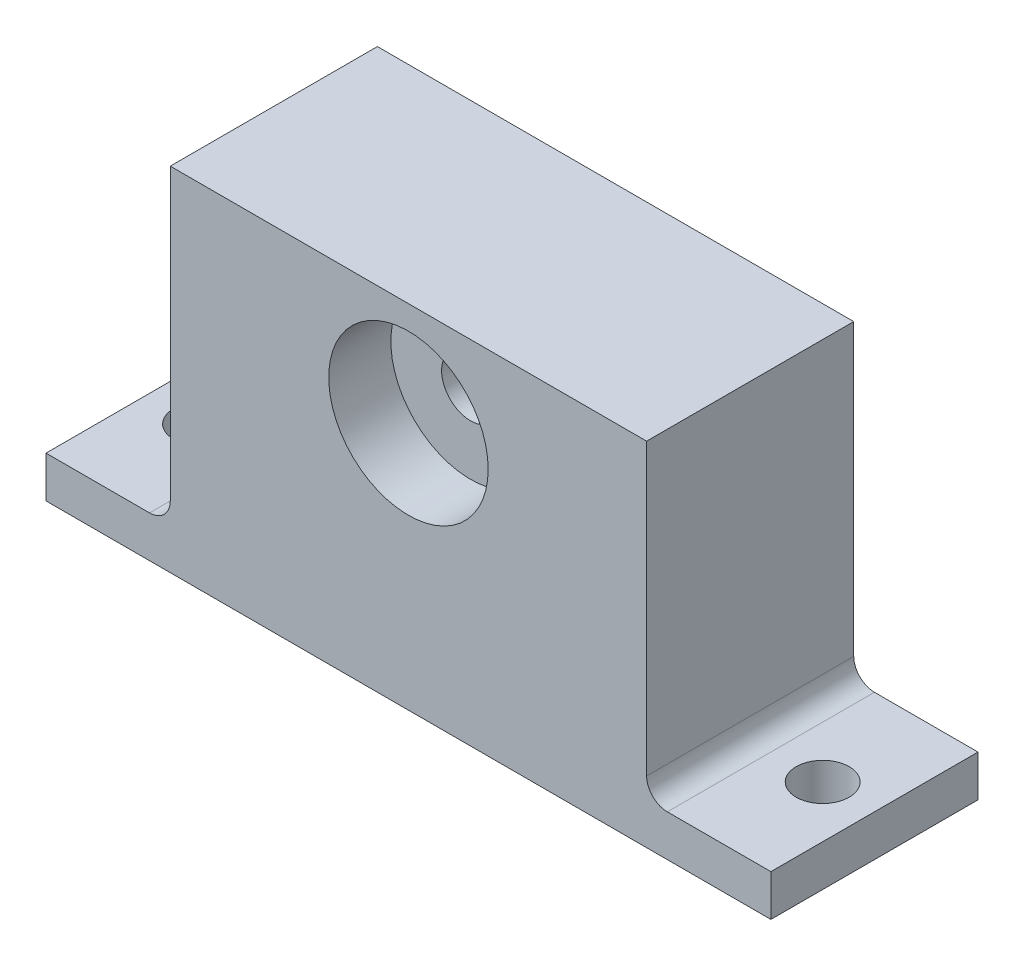
ISO-10303-21;
HEADER;
FILE_DESCRIPTION(('STEP AP214'),'2;1');
FILE_NAME('part.step','',(''),(''),'','','');
FILE_SCHEMA(('AUTOMOTIVE_DESIGN { 1 0 10303 214 1 1 1 1 }'));
ENDSEC;
DATA;
#1=APPLICATION_CONTEXT('core data for automotive mechanical design processes');
#2=APPLICATION_PROTOCOL_DEFINITION('international standard','automotive_design',2000,#1);
#3=PRODUCT_CONTEXT('',#1,'mechanical');
#4=PRODUCT('Part','Part','',(#3));
#5=PRODUCT_RELATED_PRODUCT_CATEGORY('part','',(#4));
#6=PRODUCT_DEFINITION_FORMATION('','',#4);
#7=PRODUCT_DEFINITION_CONTEXT('part definition',#1,'design');
#8=PRODUCT_DEFINITION('design','',#6,#7);
#9=PRODUCT_DEFINITION_SHAPE('','',#8);
#10=(LENGTH_UNIT() NAMED_UNIT(*) SI_UNIT(.MILLI.,.METRE.));
#11=(NAMED_UNIT(*) PLANE_ANGLE_UNIT() SI_UNIT($,.RADIAN.));
#12=(NAMED_UNIT(*) SI_UNIT($,.STERADIAN.) SOLID_ANGLE_UNIT());
#13=UNCERTAINTY_MEASURE_WITH_UNIT(LENGTH_MEASURE(1.E-05),#10,'distance_accuracy_value','');
#14=(GEOMETRIC_REPRESENTATION_CONTEXT(3) GLOBAL_UNCERTAINTY_ASSIGNED_CONTEXT((#13)) GLOBAL_UNIT_ASSIGNED_CONTEXT((#10,
#11,#12)) REPRESENTATION_CONTEXT('',''));
#15=CARTESIAN_POINT('',(0.,0.,0.));
#16=DIRECTION('',(0.,0.,1.));
#17=DIRECTION('',(1.,0.,0.));
#18=AXIS2_PLACEMENT_3D('',#15,#16,#17);
#19=CARTESIAN_POINT('',(0.,4.445,12.7));
#20=DIRECTION('',(0.,0.,-1.));
#21=DIRECTION('',(-1.,0.,0.));
#22=AXIS2_PLACEMENT_3D('',#19,#20,#21);
#23=CYLINDRICAL_SURFACE('',#22,1.778);
#24=CARTESIAN_POINT('',(0.,4.445,0.));
#25=DIRECTION('',(0.,0.,-1.));
#26=DIRECTION('',(-1.,0.,0.));
#27=AXIS2_PLACEMENT_3D('',#24,#25,#26);
#28=CIRCLE('',#27,1.778);
#29=CARTESIAN_POINT('',(-1.778,4.445,0.));
#30=VERTEX_POINT('',#29);
#31=EDGE_CURVE('E221',#30,#30,#28,.T.);
#32=ORIENTED_EDGE('',*,*,#31,.T.);
#33=EDGE_LOOP('',(#32));
#34=FACE_BOUND('',#33,.T.);
#35=CARTESIAN_POINT('',(0.,4.445,8.89));
#36=DIRECTION('',(0.,0.,1.));
#37=DIRECTION('',(1.,0.,0.));
#38=AXIS2_PLACEMENT_3D('',#35,#36,#37);
#39=CIRCLE('',#38,1.778);
#40=CARTESIAN_POINT('',(1.778,4.445,8.89));
#41=VERTEX_POINT('',#40);
#42=EDGE_CURVE('E38',#41,#41,#39,.F.);
#43=ORIENTED_EDGE('',*,*,#42,.F.);
#44=EDGE_LOOP('',(#43));
#45=FACE_BOUND('',#44,.T.);
#46=ADVANCED_FACE('F34',(#34,#45),#23,.F.);
#47=CARTESIAN_POINT('',(22.225,-10.795,12.7));
#48=DIRECTION('',(-1.,0.,0.));
#49=DIRECTION('',(0.,0.,1.));
#50=AXIS2_PLACEMENT_3D('',#47,#48,#49);
#51=PLANE('',#50);
#52=DIRECTION('',(0.,1.,0.));
#53=VECTOR('',#52,1.);
#54=CARTESIAN_POINT('',(22.225,-10.795,0.));
#55=LINE('',#54,#53);
#56=CARTESIAN_POINT('',(22.225,-10.795,0.));
#57=VERTEX_POINT('',#56);
#58=CARTESIAN_POINT('',(22.225,-8.255,0.));
#59=VERTEX_POINT('',#58);
#60=EDGE_CURVE('E142',#57,#59,#55,.T.);
#61=ORIENTED_EDGE('',*,*,#60,.T.);
#62=DIRECTION('',(0.,0.,1.));
#63=VECTOR('',#62,1.);
#64=CARTESIAN_POINT('',(22.225,-8.255,0.));
#65=LINE('',#64,#63);
#66=CARTESIAN_POINT('',(22.225,-8.255,12.7));
#67=VERTEX_POINT('',#66);
#68=EDGE_CURVE('E186',#59,#67,#65,.T.);
#69=ORIENTED_EDGE('',*,*,#68,.T.);
#70=DIRECTION('',(0.,1.,0.));
#71=VECTOR('',#70,1.);
#72=CARTESIAN_POINT('',(22.225,-10.795,12.7));
#73=LINE('',#72,#71);
#74=CARTESIAN_POINT('',(22.225,-10.795,12.7));
#75=VERTEX_POINT('',#74);
#76=EDGE_CURVE('E139',#75,#67,#73,.T.);
#77=ORIENTED_EDGE('',*,*,#76,.F.);
#78=DIRECTION('',(0.,0.,-1.));
#79=VECTOR('',#78,1.);
#80=CARTESIAN_POINT('',(22.225,-10.795,12.7));
#81=LINE('',#80,#79);
#82=EDGE_CURVE('E146',#75,#57,#81,.T.);
#83=ORIENTED_EDGE('',*,*,#82,.T.);
#84=EDGE_LOOP('',(#61,#69,#77,#83));
#85=FACE_BOUND('',#84,.T.);
#86=ADVANCED_FACE('F204',(#85),#51,.F.);
#87=CARTESIAN_POINT('',(-22.225,10.795,12.7));
#88=DIRECTION('',(0.,-1.,0.));
#89=DIRECTION('',(0.,0.,-1.));
#90=AXIS2_PLACEMENT_3D('',#87,#88,#89);
#91=PLANE('',#90);
#92=DIRECTION('',(-1.,0.,0.));
#93=VECTOR('',#92,1.);
#94=CARTESIAN_POINT('',(-22.225,10.795,0.));
#95=LINE('',#94,#93);
#96=CARTESIAN_POINT('',(14.605,10.795,0.));
#97=VERTEX_POINT('',#96);
#98=CARTESIAN_POINT('',(-14.605,10.795,0.));
#99=VERTEX_POINT('',#98);
#100=EDGE_CURVE('E137',#97,#99,#95,.T.);
#101=ORIENTED_EDGE('',*,*,#100,.T.);
#102=DIRECTION('',(0.,0.,1.));
#103=VECTOR('',#102,1.);
#104=CARTESIAN_POINT('',(-14.605,10.795,0.));
#105=LINE('',#104,#103);
#106=CARTESIAN_POINT('',(-14.605,10.795,12.7));
#107=VERTEX_POINT('',#106);
#108=EDGE_CURVE('E131',#99,#107,#105,.T.);
#109=ORIENTED_EDGE('',*,*,#108,.T.);
#110=DIRECTION('',(-1.,0.,0.));
#111=VECTOR('',#110,1.);
#112=CARTESIAN_POINT('',(-22.225,10.795,12.7));
#113=LINE('',#112,#111);
#114=CARTESIAN_POINT('',(14.605,10.795,12.7));
#115=VERTEX_POINT('',#114);
#116=EDGE_CURVE('E192',#115,#107,#113,.T.);
#117=ORIENTED_EDGE('',*,*,#116,.F.);
#118=DIRECTION('',(0.,0.,1.));
#119=VECTOR('',#118,1.);
#120=CARTESIAN_POINT('',(14.605,10.795,0.));
#121=LINE('',#120,#119);
#122=EDGE_CURVE('E189',#97,#115,#121,.T.);
#123=ORIENTED_EDGE('',*,*,#122,.F.);
#124=EDGE_LOOP('',(#101,#109,#117,#123));
#125=FACE_BOUND('',#124,.T.);
#126=ADVANCED_FACE('F244',(#125),#91,.F.);
#127=CARTESIAN_POINT('',(-22.225,-10.795,12.7));
#128=DIRECTION('',(1.,0.,0.));
#129=DIRECTION('',(0.,0.,-1.));
#130=AXIS2_PLACEMENT_3D('',#127,#128,#129);
#131=PLANE('',#130);
#132=DIRECTION('',(0.,-1.,0.));
#133=VECTOR('',#132,1.);
#134=CARTESIAN_POINT('',(-22.225,-10.795,12.7));
#135=LINE('',#134,#133);
#136=CARTESIAN_POINT('',(-22.225,-8.255,12.7));
#137=VERTEX_POINT('',#136);
#138=CARTESIAN_POINT('',(-22.225,-10.795,12.7));
#139=VERTEX_POINT('',#138);
#140=EDGE_CURVE('E130',#137,#139,#135,.T.);
#141=ORIENTED_EDGE('',*,*,#140,.F.);
#142=DIRECTION('',(0.,0.,1.));
#143=VECTOR('',#142,1.);
#144=CARTESIAN_POINT('',(-22.225,-8.255,0.));
#145=LINE('',#144,#143);
#146=CARTESIAN_POINT('',(-22.225,-8.255,0.));
#147=VERTEX_POINT('',#146);
#148=EDGE_CURVE('E114',#147,#137,#145,.T.);
#149=ORIENTED_EDGE('',*,*,#148,.F.);
#150=DIRECTION('',(0.,-1.,0.));
#151=VECTOR('',#150,1.);
#152=CARTESIAN_POINT('',(-22.225,-10.795,0.));
#153=LINE('',#152,#151);
#154=CARTESIAN_POINT('',(-22.225,-10.795,0.));
#155=VERTEX_POINT('',#154);
#156=EDGE_CURVE('E128',#147,#155,#153,.T.);
#157=ORIENTED_EDGE('',*,*,#156,.T.);
#158=DIRECTION('',(0.,0.,-1.));
#159=VECTOR('',#158,1.);
#160=CARTESIAN_POINT('',(-22.225,-10.795,12.7));
#161=LINE('',#160,#159);
#162=EDGE_CURVE('E149',#139,#155,#161,.T.);
#163=ORIENTED_EDGE('',*,*,#162,.F.);
#164=EDGE_LOOP('',(#141,#149,#157,#163));
#165=FACE_BOUND('',#164,.T.);
#166=ADVANCED_FACE('F126',(#165),#131,.F.);
#167=CARTESIAN_POINT('',(-22.225,-10.795,12.7));
#168=DIRECTION('',(0.,1.,0.));
#169=DIRECTION('',(0.,0.,1.));
#170=AXIS2_PLACEMENT_3D('',#167,#168,#169);
#171=PLANE('',#170);
#172=CARTESIAN_POINT('',(19.05,-10.795,6.35));
#173=DIRECTION('',(0.,1.,0.));
#174=DIRECTION('',(0.,0.,1.));
#175=AXIS2_PLACEMENT_3D('',#172,#173,#174);
#176=CIRCLE('',#175,1.6256);
#177=CARTESIAN_POINT('',(19.05,-10.795,7.9756));
#178=VERTEX_POINT('',#177);
#179=EDGE_CURVE('E182',#178,#178,#176,.T.);
#180=ORIENTED_EDGE('',*,*,#179,.T.);
#181=EDGE_LOOP('',(#180));
#182=FACE_BOUND('',#181,.T.);
#183=CARTESIAN_POINT('',(-19.05,-10.795,6.4262));
#184=DIRECTION('',(0.,1.,0.));
#185=DIRECTION('',(0.,0.,1.));
#186=AXIS2_PLACEMENT_3D('',#183,#184,#185);
#187=CIRCLE('',#186,1.6256);
#188=CARTESIAN_POINT('',(-19.05,-10.795,8.0518));
#189=VERTEX_POINT('',#188);
#190=EDGE_CURVE('E214',#189,#189,#187,.T.);
#191=ORIENTED_EDGE('',*,*,#190,.T.);
#192=EDGE_LOOP('',(#191));
#193=FACE_BOUND('',#192,.T.);
#194=DIRECTION('',(1.,0.,0.));
#195=VECTOR('',#194,1.);
#196=CARTESIAN_POINT('',(-22.225,-10.795,0.));
#197=LINE('',#196,#195);
#198=EDGE_CURVE('E136',#155,#57,#197,.T.);
#199=ORIENTED_EDGE('',*,*,#198,.T.);
#200=ORIENTED_EDGE('',*,*,#82,.F.);
#201=DIRECTION('',(1.,0.,0.));
#202=VECTOR('',#201,1.);
#203=CARTESIAN_POINT('',(-22.225,-10.795,12.7));
#204=LINE('',#203,#202);
#205=EDGE_CURVE('E150',#139,#75,#204,.T.);
#206=ORIENTED_EDGE('',*,*,#205,.F.);
#207=ORIENTED_EDGE('',*,*,#162,.T.);
#208=EDGE_LOOP('',(#199,#200,#206,#207));
#209=FACE_BOUND('',#208,.T.);
#210=ADVANCED_FACE('F208',(#182,#193,#209),#171,.F.);
#211=CARTESIAN_POINT('',(0.,0.,12.7));
#212=DIRECTION('',(0.,0.,-1.));
#213=DIRECTION('',(-1.,0.,0.));
#214=AXIS2_PLACEMENT_3D('',#211,#212,#213);
#215=PLANE('',#214);
#216=CARTESIAN_POINT('',(0.,4.445,12.7));
#217=DIRECTION('',(0.,0.,1.));
#218=DIRECTION('',(1.,0.,0.));
#219=AXIS2_PLACEMENT_3D('',#216,#217,#218);
#220=CIRCLE('',#219,4.8895);
#221=CARTESIAN_POINT('',(4.8895,4.445,12.7));
#222=VERTEX_POINT('',#221);
#223=EDGE_CURVE('E226',#222,#222,#220,.T.);
#224=ORIENTED_EDGE('',*,*,#223,.F.);
#225=EDGE_LOOP('',(#224));
#226=FACE_BOUND('',#225,.T.);
#227=ORIENTED_EDGE('',*,*,#116,.T.);
#228=DIRECTION('',(0.,1.,0.));
#229=VECTOR('',#228,1.);
#230=CARTESIAN_POINT('',(-14.605,10.795,12.7));
#231=LINE('',#230,#229);
#232=CARTESIAN_POINT('',(-14.605,-6.985,12.7));
#233=VERTEX_POINT('',#232);
#234=EDGE_CURVE('E122',#233,#107,#231,.T.);
#235=ORIENTED_EDGE('',*,*,#234,.F.);
#236=CARTESIAN_POINT('',(-15.875,-6.985,12.7));
#237=DIRECTION('',(0.,0.,-1.));
#238=DIRECTION('',(-1.,0.,0.));
#239=AXIS2_PLACEMENT_3D('',#236,#237,#238);
#240=CIRCLE('',#239,1.27);
#241=CARTESIAN_POINT('',(-15.875,-8.255,12.7));
#242=VERTEX_POINT('',#241);
#243=EDGE_CURVE('E156',#233,#242,#240,.T.);
#244=ORIENTED_EDGE('',*,*,#243,.T.);
#245=DIRECTION('',(1.,0.,0.));
#246=VECTOR('',#245,1.);
#247=CARTESIAN_POINT('',(-22.225,-8.255,12.7));
#248=LINE('',#247,#246);
#249=EDGE_CURVE('E188',#137,#242,#248,.T.);
#250=ORIENTED_EDGE('',*,*,#249,.F.);
#251=ORIENTED_EDGE('',*,*,#140,.T.);
#252=ORIENTED_EDGE('',*,*,#205,.T.);
#253=ORIENTED_EDGE('',*,*,#76,.T.);
#254=DIRECTION('',(1.,0.,0.));
#255=VECTOR('',#254,1.);
#256=CARTESIAN_POINT('',(22.225,-8.255,12.7));
#257=LINE('',#256,#255);
#258=CARTESIAN_POINT('',(15.875,-8.255,12.7));
#259=VERTEX_POINT('',#258);
#260=EDGE_CURVE('E169',#259,#67,#257,.T.);
#261=ORIENTED_EDGE('',*,*,#260,.F.);
#262=CARTESIAN_POINT('',(15.875,-6.985,12.7));
#263=DIRECTION('',(0.,0.,-1.));
#264=DIRECTION('',(-1.,0.,0.));
#265=AXIS2_PLACEMENT_3D('',#262,#263,#264);
#266=CIRCLE('',#265,1.27);
#267=CARTESIAN_POINT('',(14.605,-6.985,12.7));
#268=VERTEX_POINT('',#267);
#269=EDGE_CURVE('E43',#259,#268,#266,.T.);
#270=ORIENTED_EDGE('',*,*,#269,.T.);
#271=DIRECTION('',(0.,-1.,0.));
#272=VECTOR('',#271,1.);
#273=CARTESIAN_POINT('',(14.605,10.795,12.7));
#274=LINE('',#273,#272);
#275=EDGE_CURVE('E179',#115,#268,#274,.T.);
#276=ORIENTED_EDGE('',*,*,#275,.F.);
#277=EDGE_LOOP('',(#227,#235,#244,#250,#251,#252,#253,#261,#270,#276));
#278=FACE_BOUND('',#277,.T.);
#279=ADVANCED_FACE('F176',(#226,#278),#215,.F.);
#280=CARTESIAN_POINT('',(0.,0.,0.));
#281=DIRECTION('',(0.,0.,-1.));
#282=DIRECTION('',(-1.,0.,0.));
#283=AXIS2_PLACEMENT_3D('',#280,#281,#282);
#284=PLANE('',#283);
#285=ORIENTED_EDGE('',*,*,#31,.F.);
#286=EDGE_LOOP('',(#285));
#287=FACE_BOUND('',#286,.T.);
#288=DIRECTION('',(1.,0.,0.));
#289=VECTOR('',#288,1.);
#290=CARTESIAN_POINT('',(-22.225,-8.255,0.));
#291=LINE('',#290,#289);
#292=CARTESIAN_POINT('',(-15.875,-8.255,0.));
#293=VERTEX_POINT('',#292);
#294=EDGE_CURVE('E110',#147,#293,#291,.T.);
#295=ORIENTED_EDGE('',*,*,#294,.T.);
#296=CARTESIAN_POINT('',(-15.875,-6.985,0.));
#297=DIRECTION('',(0.,0.,-1.));
#298=DIRECTION('',(-1.,0.,0.));
#299=AXIS2_PLACEMENT_3D('',#296,#297,#298);
#300=CIRCLE('',#299,1.27);
#301=CARTESIAN_POINT('',(-14.605,-6.985,0.));
#302=VERTEX_POINT('',#301);
#303=EDGE_CURVE('E158',#293,#302,#300,.F.);
#304=ORIENTED_EDGE('',*,*,#303,.T.);
#305=DIRECTION('',(0.,1.,0.));
#306=VECTOR('',#305,1.);
#307=CARTESIAN_POINT('',(-14.605,10.795,0.));
#308=LINE('',#307,#306);
#309=EDGE_CURVE('E121',#302,#99,#308,.T.);
#310=ORIENTED_EDGE('',*,*,#309,.T.);
#311=ORIENTED_EDGE('',*,*,#100,.F.);
#312=DIRECTION('',(0.,-1.,0.));
#313=VECTOR('',#312,1.);
#314=CARTESIAN_POINT('',(14.605,10.795,0.));
#315=LINE('',#314,#313);
#316=CARTESIAN_POINT('',(14.605,-6.985,0.));
#317=VERTEX_POINT('',#316);
#318=EDGE_CURVE('E178',#97,#317,#315,.T.);
#319=ORIENTED_EDGE('',*,*,#318,.T.);
#320=CARTESIAN_POINT('',(15.875,-6.985,0.));
#321=DIRECTION('',(0.,0.,-1.));
#322=DIRECTION('',(-1.,0.,0.));
#323=AXIS2_PLACEMENT_3D('',#320,#321,#322);
#324=CIRCLE('',#323,1.27);
#325=CARTESIAN_POINT('',(15.875,-8.255,0.));
#326=VERTEX_POINT('',#325);
#327=EDGE_CURVE('E11',#317,#326,#324,.F.);
#328=ORIENTED_EDGE('',*,*,#327,.T.);
#329=DIRECTION('',(1.,0.,0.));
#330=VECTOR('',#329,1.);
#331=CARTESIAN_POINT('',(22.225,-8.255,0.));
#332=LINE('',#331,#330);
#333=EDGE_CURVE('E171',#326,#59,#332,.T.);
#334=ORIENTED_EDGE('',*,*,#333,.T.);
#335=ORIENTED_EDGE('',*,*,#60,.F.);
#336=ORIENTED_EDGE('',*,*,#198,.F.);
#337=ORIENTED_EDGE('',*,*,#156,.F.);
#338=EDGE_LOOP('',(#295,#304,#310,#311,#319,#328,#334,#335,#336,#337));
#339=FACE_BOUND('',#338,.T.);
#340=ADVANCED_FACE('F134',(#287,#339),#284,.T.);
#341=CARTESIAN_POINT('',(22.225,-8.255,0.));
#342=DIRECTION('',(0.,-1.,0.));
#343=DIRECTION('',(0.,0.,-1.));
#344=AXIS2_PLACEMENT_3D('',#341,#342,#343);
#345=PLANE('',#344);
#346=CARTESIAN_POINT('',(19.05,-8.255,6.35));
#347=DIRECTION('',(0.,1.,0.));
#348=DIRECTION('',(-1.,0.,0.));
#349=AXIS2_PLACEMENT_3D('',#346,#347,#348);
#350=CIRCLE('',#349,1.6256);
#351=CARTESIAN_POINT('',(17.4244,-8.255,6.35));
#352=VERTEX_POINT('',#351);
#353=EDGE_CURVE('E217',#352,#352,#350,.T.);
#354=ORIENTED_EDGE('',*,*,#353,.F.);
#355=EDGE_LOOP('',(#354));
#356=FACE_BOUND('',#355,.T.);
#357=ORIENTED_EDGE('',*,*,#333,.F.);
#358=DIRECTION('',(0.,0.,1.));
#359=VECTOR('',#358,1.);
#360=CARTESIAN_POINT('',(15.875,-8.255,12.7));
#361=LINE('',#360,#359);
#362=EDGE_CURVE('E160',#326,#259,#361,.T.);
#363=ORIENTED_EDGE('',*,*,#362,.T.);
#364=ORIENTED_EDGE('',*,*,#260,.T.);
#365=ORIENTED_EDGE('',*,*,#68,.F.);
#366=EDGE_LOOP('',(#357,#363,#364,#365));
#367=FACE_BOUND('',#366,.T.);
#368=ADVANCED_FACE('F167',(#356,#367),#345,.F.);
#369=CARTESIAN_POINT('',(14.605,10.795,0.));
#370=DIRECTION('',(-1.,0.,0.));
#371=DIRECTION('',(0.,-1.,0.));
#372=AXIS2_PLACEMENT_3D('',#369,#370,#371);
#373=PLANE('',#372);
#374=ORIENTED_EDGE('',*,*,#275,.T.);
#375=DIRECTION('',(0.,0.,1.));
#376=VECTOR('',#375,1.);
#377=CARTESIAN_POINT('',(14.605,-6.985,0.));
#378=LINE('',#377,#376);
#379=EDGE_CURVE('E50',#268,#317,#378,.F.);
#380=ORIENTED_EDGE('',*,*,#379,.T.);
#381=ORIENTED_EDGE('',*,*,#318,.F.);
#382=ORIENTED_EDGE('',*,*,#122,.T.);
#383=EDGE_LOOP('',(#374,#380,#381,#382));
#384=FACE_BOUND('',#383,.T.);
#385=ADVANCED_FACE('F261',(#384),#373,.F.);
#386=CARTESIAN_POINT('',(-14.605,10.795,0.));
#387=DIRECTION('',(1.,0.,0.));
#388=DIRECTION('',(0.,1.,0.));
#389=AXIS2_PLACEMENT_3D('',#386,#387,#388);
#390=PLANE('',#389);
#391=ORIENTED_EDGE('',*,*,#309,.F.);
#392=DIRECTION('',(0.,0.,1.));
#393=VECTOR('',#392,1.);
#394=CARTESIAN_POINT('',(-14.605,-6.985,12.7));
#395=LINE('',#394,#393);
#396=EDGE_CURVE('E152',#302,#233,#395,.T.);
#397=ORIENTED_EDGE('',*,*,#396,.T.);
#398=ORIENTED_EDGE('',*,*,#234,.T.);
#399=ORIENTED_EDGE('',*,*,#108,.F.);
#400=EDGE_LOOP('',(#391,#397,#398,#399));
#401=FACE_BOUND('',#400,.T.);
#402=ADVANCED_FACE('F258',(#401),#390,.F.);
#403=CARTESIAN_POINT('',(-22.225,-8.255,0.));
#404=DIRECTION('',(0.,-1.,0.));
#405=DIRECTION('',(0.,0.,-1.));
#406=AXIS2_PLACEMENT_3D('',#403,#404,#405);
#407=PLANE('',#406);
#408=CARTESIAN_POINT('',(-19.05,-8.25499999999999,6.4262));
#409=DIRECTION('',(0.,1.,0.));
#410=DIRECTION('',(-1.,0.,0.));
#411=AXIS2_PLACEMENT_3D('',#408,#409,#410);
#412=CIRCLE('',#411,1.6256);
#413=CARTESIAN_POINT('',(-20.6756,-8.25499999999999,6.4262));
#414=VERTEX_POINT('',#413);
#415=EDGE_CURVE('E218',#414,#414,#412,.T.);
#416=ORIENTED_EDGE('',*,*,#415,.F.);
#417=EDGE_LOOP('',(#416));
#418=FACE_BOUND('',#417,.T.);
#419=ORIENTED_EDGE('',*,*,#249,.T.);
#420=DIRECTION('',(0.,0.,1.));
#421=VECTOR('',#420,1.);
#422=CARTESIAN_POINT('',(-15.875,-8.255,0.));
#423=LINE('',#422,#421);
#424=EDGE_CURVE('E117',#242,#293,#423,.F.);
#425=ORIENTED_EDGE('',*,*,#424,.T.);
#426=ORIENTED_EDGE('',*,*,#294,.F.);
#427=ORIENTED_EDGE('',*,*,#148,.T.);
#428=EDGE_LOOP('',(#419,#425,#426,#427));
#429=FACE_BOUND('',#428,.T.);
#430=ADVANCED_FACE('F113',(#418,#429),#407,.F.);
#431=CARTESIAN_POINT('',(-15.875,-6.985,0.));
#432=DIRECTION('',(0.,0.,-1.));
#433=DIRECTION('',(-1.,0.,0.));
#434=AXIS2_PLACEMENT_3D('',#431,#432,#433);
#435=CYLINDRICAL_SURFACE('',#434,1.27);
#436=ORIENTED_EDGE('',*,*,#303,.F.);
#437=ORIENTED_EDGE('',*,*,#424,.F.);
#438=ORIENTED_EDGE('',*,*,#243,.F.);
#439=ORIENTED_EDGE('',*,*,#396,.F.);
#440=EDGE_LOOP('',(#436,#437,#438,#439));
#441=FACE_BOUND('',#440,.T.);
#442=ADVANCED_FACE('F265',(#441),#435,.F.);
#443=CARTESIAN_POINT('',(15.875,-6.985,0.));
#444=DIRECTION('',(0.,0.,-1.));
#445=DIRECTION('',(-1.,0.,0.));
#446=AXIS2_PLACEMENT_3D('',#443,#444,#445);
#447=CYLINDRICAL_SURFACE('',#446,1.27);
#448=ORIENTED_EDGE('',*,*,#327,.F.);
#449=ORIENTED_EDGE('',*,*,#379,.F.);
#450=ORIENTED_EDGE('',*,*,#269,.F.);
#451=ORIENTED_EDGE('',*,*,#362,.F.);
#452=EDGE_LOOP('',(#448,#449,#450,#451));
#453=FACE_BOUND('',#452,.T.);
#454=ADVANCED_FACE('F36',(#453),#447,.F.);
#455=CARTESIAN_POINT('',(-19.05,-20.955,6.4262));
#456=DIRECTION('',(0.,1.,0.));
#457=DIRECTION('',(-1.,0.,0.));
#458=AXIS2_PLACEMENT_3D('',#455,#456,#457);
#459=CYLINDRICAL_SURFACE('',#458,1.6256);
#460=ORIENTED_EDGE('',*,*,#415,.T.);
#461=EDGE_LOOP('',(#460));
#462=FACE_BOUND('',#461,.T.);
#463=ORIENTED_EDGE('',*,*,#190,.F.);
#464=EDGE_LOOP('',(#463));
#465=FACE_BOUND('',#464,.T.);
#466=ADVANCED_FACE('F253',(#462,#465),#459,.F.);
#467=CARTESIAN_POINT('',(19.05,-20.955,6.35));
#468=DIRECTION('',(0.,1.,0.));
#469=DIRECTION('',(-1.,0.,0.));
#470=AXIS2_PLACEMENT_3D('',#467,#468,#469);
#471=CYLINDRICAL_SURFACE('',#470,1.6256);
#472=ORIENTED_EDGE('',*,*,#353,.T.);
#473=EDGE_LOOP('',(#472));
#474=FACE_BOUND('',#473,.T.);
#475=ORIENTED_EDGE('',*,*,#179,.F.);
#476=EDGE_LOOP('',(#475));
#477=FACE_BOUND('',#476,.T.);
#478=ADVANCED_FACE('F250',(#474,#477),#471,.F.);
#479=CARTESIAN_POINT('',(0.,4.445,8.89));
#480=DIRECTION('',(0.,0.,1.));
#481=DIRECTION('',(1.,0.,0.));
#482=AXIS2_PLACEMENT_3D('',#479,#480,#481);
#483=PLANE('',#482);
#484=CARTESIAN_POINT('',(0.,4.445,8.89));
#485=DIRECTION('',(0.,0.,1.));
#486=DIRECTION('',(1.,0.,0.));
#487=AXIS2_PLACEMENT_3D('',#484,#485,#486);
#488=CIRCLE('',#487,4.8895);
#489=CARTESIAN_POINT('',(4.8895,4.445,8.89));
#490=VERTEX_POINT('',#489);
#491=EDGE_CURVE('E229',#490,#490,#488,.T.);
#492=ORIENTED_EDGE('',*,*,#491,.T.);
#493=EDGE_LOOP('',(#492));
#494=FACE_BOUND('',#493,.T.);
#495=ORIENTED_EDGE('',*,*,#42,.T.);
#496=EDGE_LOOP('',(#495));
#497=FACE_BOUND('',#496,.T.);
#498=ADVANCED_FACE('F236',(#494,#497),#483,.T.);
#499=CARTESIAN_POINT('',(0.,4.445,8.89));
#500=DIRECTION('',(0.,0.,1.));
#501=DIRECTION('',(1.,0.,0.));
#502=AXIS2_PLACEMENT_3D('',#499,#500,#501);
#503=CYLINDRICAL_SURFACE('',#502,4.8895);
#504=CARTESIAN_POINT('',(4.8895,4.445,8.89));
#505=CARTESIAN_POINT('',(4.8895,4.445,8.9296875));
#506=CARTESIAN_POINT('',(4.8895,4.445,8.969375));
#507=CARTESIAN_POINT('',(4.8895,4.445,9.04875));
#508=CARTESIAN_POINT('',(4.8895,4.445,9.0884375));
#509=CARTESIAN_POINT('',(4.8895,4.445,9.1678125));
#510=CARTESIAN_POINT('',(4.8895,4.445,9.2075));
#511=CARTESIAN_POINT('',(4.8895,4.445,9.286875));
#512=CARTESIAN_POINT('',(4.8895,4.445,9.3265625));
#513=CARTESIAN_POINT('',(4.8895,4.445,9.4059375));
#514=CARTESIAN_POINT('',(4.8895,4.445,9.445625));
#515=CARTESIAN_POINT('',(4.8895,4.445,9.525));
#516=CARTESIAN_POINT('',(4.8895,4.445,9.5646875));
#517=CARTESIAN_POINT('',(4.8895,4.445,9.6440625));
#518=CARTESIAN_POINT('',(4.8895,4.445,9.68375));
#519=CARTESIAN_POINT('',(4.8895,4.445,9.763125));
#520=CARTESIAN_POINT('',(4.8895,4.445,9.8028125));
#521=CARTESIAN_POINT('',(4.8895,4.445,9.8821875));
#522=CARTESIAN_POINT('',(4.8895,4.445,9.921875));
#523=CARTESIAN_POINT('',(4.8895,4.445,10.00125));
#524=CARTESIAN_POINT('',(4.8895,4.445,10.0409375));
#525=CARTESIAN_POINT('',(4.8895,4.445,10.1203125));
#526=CARTESIAN_POINT('',(4.8895,4.445,10.16));
#527=CARTESIAN_POINT('',(4.8895,4.445,10.239375));
#528=CARTESIAN_POINT('',(4.8895,4.445,10.2790625));
#529=CARTESIAN_POINT('',(4.8895,4.445,10.3584375));
#530=CARTESIAN_POINT('',(4.8895,4.445,10.398125));
#531=CARTESIAN_POINT('',(4.8895,4.445,10.4775));
#532=CARTESIAN_POINT('',(4.8895,4.445,10.5171875));
#533=CARTESIAN_POINT('',(4.8895,4.445,10.5965625));
#534=CARTESIAN_POINT('',(4.8895,4.445,10.63625));
#535=CARTESIAN_POINT('',(4.8895,4.445,10.715625));
#536=CARTESIAN_POINT('',(4.8895,4.445,10.7553125));
#537=CARTESIAN_POINT('',(4.8895,4.445,10.8346875));
#538=CARTESIAN_POINT('',(4.8895,4.445,10.874375));
#539=CARTESIAN_POINT('',(4.8895,4.445,10.95375));
#540=CARTESIAN_POINT('',(4.8895,4.445,10.9934375));
#541=CARTESIAN_POINT('',(4.8895,4.445,11.0728125));
#542=CARTESIAN_POINT('',(4.8895,4.445,11.1125));
#543=CARTESIAN_POINT('',(4.8895,4.445,11.191875));
#544=CARTESIAN_POINT('',(4.8895,4.445,11.2315625));
#545=CARTESIAN_POINT('',(4.8895,4.445,11.3109375));
#546=CARTESIAN_POINT('',(4.8895,4.445,11.350625));
#547=CARTESIAN_POINT('',(4.8895,4.445,11.43));
#548=CARTESIAN_POINT('',(4.8895,4.445,11.4696875));
#549=CARTESIAN_POINT('',(4.8895,4.445,11.5490625));
#550=CARTESIAN_POINT('',(4.8895,4.445,11.58875));
#551=CARTESIAN_POINT('',(4.8895,4.445,11.668125));
#552=CARTESIAN_POINT('',(4.8895,4.445,11.7078125));
#553=CARTESIAN_POINT('',(4.8895,4.445,11.7871875));
#554=CARTESIAN_POINT('',(4.8895,4.445,11.826875));
#555=CARTESIAN_POINT('',(4.8895,4.445,11.90625));
#556=CARTESIAN_POINT('',(4.8895,4.445,11.9459375));
#557=CARTESIAN_POINT('',(4.8895,4.445,12.0253125));
#558=CARTESIAN_POINT('',(4.8895,4.445,12.065));
#559=CARTESIAN_POINT('',(4.8895,4.445,12.144375));
#560=CARTESIAN_POINT('',(4.8895,4.445,12.1840625));
#561=CARTESIAN_POINT('',(4.8895,4.445,12.2634375));
#562=CARTESIAN_POINT('',(4.8895,4.445,12.303125));
#563=CARTESIAN_POINT('',(4.8895,4.445,12.3825));
#564=CARTESIAN_POINT('',(4.8895,4.445,12.4221875));
#565=CARTESIAN_POINT('',(4.8895,4.445,12.5015625));
#566=CARTESIAN_POINT('',(4.8895,4.445,12.54125));
#567=CARTESIAN_POINT('',(4.8895,4.445,12.620625));
#568=CARTESIAN_POINT('',(4.8895,4.445,12.6603125));
#569=CARTESIAN_POINT('',(4.8895,4.445,12.7));
#570=B_SPLINE_CURVE_WITH_KNOTS('',3,(#504,#505,#506,#507,#508,#509,#510,#511,#512,#513,#514,
#515,#516,#517,#518,#519,#520,#521,#522,#523,#524,#525,#526,#527,#528,#529,#530,#531,#532,#533,
#534,#535,#536,#537,#538,#539,#540,#541,#542,#543,#544,#545,#546,#547,#548,#549,#550,#551,#552,
#553,#554,#555,#556,#557,#558,#559,#560,#561,#562,#563,#564,#565,#566,#567,#568,#569),
.UNSPECIFIED.,.F.,.F.,(4,2,2,2,2,2,2,2,2,2,2,2,2,2,2,2,2,2,2,2,2,2,2,2,2,2,2,2,2,2,2,2,4),(0.,
0.119062500000001,0.238125,0.357187500000002,0.476250000000001,0.5953125,0.714375,
0.833437500000001,0.9525,1.0715625,1.190625,1.3096875,1.42875,1.5478125,1.666875,1.7859375,
1.905,2.0240625,2.143125,2.2621875,2.38125,2.5003125,2.619375,2.7384375,2.8575,2.9765625,
3.095625,3.2146875,3.33375,3.4528125,3.571875,3.6909375,3.81),.UNSPECIFIED.);
#571=EDGE_CURVE('BSEAM248',#490,#222,#570,.T.);
#572=ORIENTED_EDGE('',*,*,#491,.F.);
#573=ORIENTED_EDGE('',*,*,#223,.T.);
#574=ORIENTED_EDGE('',*,*,#571,.T.);
#575=ORIENTED_EDGE('',*,*,#571,.F.);
#576=EDGE_LOOP('',(#572,#574,#573,#575));
#577=FACE_BOUND('',#576,.T.);
#578=ADVANCED_FACE('F248',(#577),#503,.F.);
#579=CLOSED_SHELL('',(#46,#86,#126,#166,#210,#279,#340,#368,#385,#402,#430,#442,#454,#466,#478,
#498,#578));
#580=MANIFOLD_SOLID_BREP('B2',#579);
#581=ADVANCED_BREP_SHAPE_REPRESENTATION('',(#18,#580),#14);
#582=SHAPE_DEFINITION_REPRESENTATION(#9,#581);
ENDSEC;
END-ISO-10303-21;
